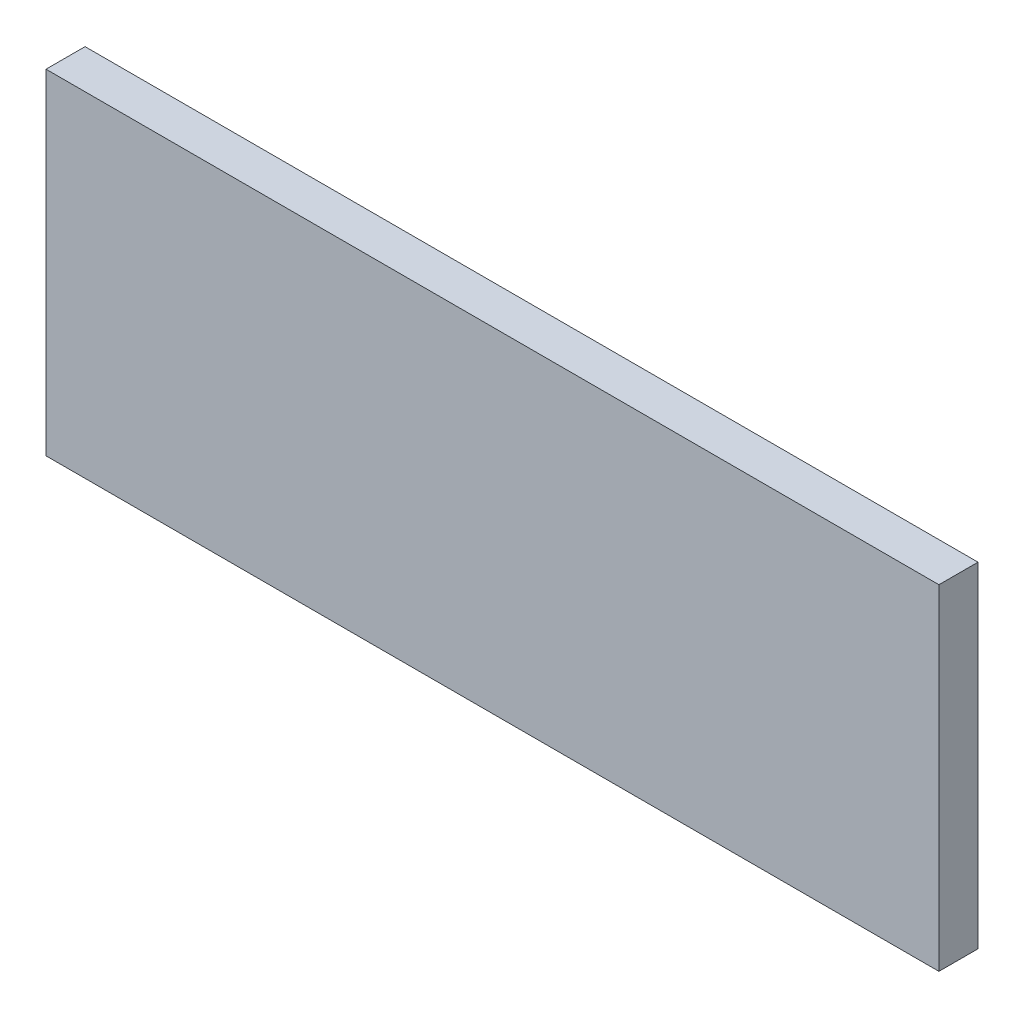
ISO-10303-21;
HEADER;
FILE_DESCRIPTION(('STEP AP214'),'2;1');
FILE_NAME('part.step','',(''),(''),'','','');
FILE_SCHEMA(('AUTOMOTIVE_DESIGN { 1 0 10303 214 1 1 1 1 }'));
ENDSEC;
DATA;
#1=APPLICATION_CONTEXT('core data for automotive mechanical design processes');
#2=APPLICATION_PROTOCOL_DEFINITION('international standard','automotive_design',2000,#1);
#3=PRODUCT_CONTEXT('',#1,'mechanical');
#4=PRODUCT('Part','Part','',(#3));
#5=PRODUCT_RELATED_PRODUCT_CATEGORY('part','',(#4));
#6=PRODUCT_DEFINITION_FORMATION('','',#4);
#7=PRODUCT_DEFINITION_CONTEXT('part definition',#1,'design');
#8=PRODUCT_DEFINITION('design','',#6,#7);
#9=PRODUCT_DEFINITION_SHAPE('','',#8);
#10=(LENGTH_UNIT() NAMED_UNIT(*) SI_UNIT(.MILLI.,.METRE.));
#11=(NAMED_UNIT(*) PLANE_ANGLE_UNIT() SI_UNIT($,.RADIAN.));
#12=(NAMED_UNIT(*) SI_UNIT($,.STERADIAN.) SOLID_ANGLE_UNIT());
#13=UNCERTAINTY_MEASURE_WITH_UNIT(LENGTH_MEASURE(1.E-05),#10,'distance_accuracy_value','');
#14=(GEOMETRIC_REPRESENTATION_CONTEXT(3) GLOBAL_UNCERTAINTY_ASSIGNED_CONTEXT((#13)) GLOBAL_UNIT_ASSIGNED_CONTEXT((#10,
#11,#12)) REPRESENTATION_CONTEXT('',''));
#15=CARTESIAN_POINT('',(0.,0.,0.));
#16=DIRECTION('',(0.,0.,1.));
#17=DIRECTION('',(1.,0.,0.));
#18=AXIS2_PLACEMENT_3D('',#15,#16,#17);
#19=CARTESIAN_POINT('',(133.818,-116.554,1.635));
#20=DIRECTION('',(0.,0.,-1.));
#21=DIRECTION('',(0.,-1.,0.));
#22=AXIS2_PLACEMENT_3D('',#19,#20,#21);
#23=PLANE('',#22);
#24=DIRECTION('',(0.,-1.,0.));
#25=VECTOR('',#24,1.);
#26=CARTESIAN_POINT('',(134.218,-116.404,1.635));
#27=LINE('',#26,#25);
#28=CARTESIAN_POINT('',(134.218,-116.404,1.635));
#29=VERTEX_POINT('',#28);
#30=CARTESIAN_POINT('',(134.218,-116.704,1.635));
#31=VERTEX_POINT('',#30);
#32=EDGE_CURVE('E21',#29,#31,#27,.T.);
#33=ORIENTED_EDGE('',*,*,#32,.F.);
#34=DIRECTION('',(1.,0.,0.));
#35=VECTOR('',#34,1.);
#36=CARTESIAN_POINT('',(133.418,-116.404,1.635));
#37=LINE('',#36,#35);
#38=CARTESIAN_POINT('',(133.418,-116.404,1.635));
#39=VERTEX_POINT('',#38);
#40=EDGE_CURVE('E108',#39,#29,#37,.T.);
#41=ORIENTED_EDGE('',*,*,#40,.F.);
#42=DIRECTION('',(0.,1.,0.));
#43=VECTOR('',#42,1.);
#44=CARTESIAN_POINT('',(133.418,-116.704,1.635));
#45=LINE('',#44,#43);
#46=CARTESIAN_POINT('',(133.418,-116.704,1.635));
#47=VERTEX_POINT('',#46);
#48=EDGE_CURVE('E84',#47,#39,#45,.T.);
#49=ORIENTED_EDGE('',*,*,#48,.F.);
#50=DIRECTION('',(-1.,0.,0.));
#51=VECTOR('',#50,1.);
#52=CARTESIAN_POINT('',(134.218,-116.704,1.635));
#53=LINE('',#52,#51);
#54=EDGE_CURVE('E88',#31,#47,#53,.T.);
#55=ORIENTED_EDGE('',*,*,#54,.F.);
#56=EDGE_LOOP('',(#33,#41,#49,#55));
#57=FACE_BOUND('',#56,.T.);
#58=ADVANCED_FACE('F17',(#57),#23,.F.);
#59=CARTESIAN_POINT('',(133.818,-116.554,1.6));
#60=DIRECTION('',(0.,0.,-1.));
#61=DIRECTION('',(0.,-1.,0.));
#62=AXIS2_PLACEMENT_3D('',#59,#60,#61);
#63=PLANE('',#62);
#64=DIRECTION('',(-1.,0.,0.));
#65=VECTOR('',#64,1.);
#66=CARTESIAN_POINT('',(134.218,-116.704,1.6));
#67=LINE('',#66,#65);
#68=CARTESIAN_POINT('',(134.218,-116.704,1.6));
#69=VERTEX_POINT('',#68);
#70=CARTESIAN_POINT('',(133.418,-116.704,1.6));
#71=VERTEX_POINT('',#70);
#72=EDGE_CURVE('E72',#69,#71,#67,.T.);
#73=ORIENTED_EDGE('',*,*,#72,.T.);
#74=DIRECTION('',(0.,1.,0.));
#75=VECTOR('',#74,1.);
#76=CARTESIAN_POINT('',(133.418,-116.704,1.6));
#77=LINE('',#76,#75);
#78=CARTESIAN_POINT('',(133.418,-116.404,1.6));
#79=VERTEX_POINT('',#78);
#80=EDGE_CURVE('E105',#71,#79,#77,.T.);
#81=ORIENTED_EDGE('',*,*,#80,.T.);
#82=DIRECTION('',(1.,0.,0.));
#83=VECTOR('',#82,1.);
#84=CARTESIAN_POINT('',(133.418,-116.404,1.6));
#85=LINE('',#84,#83);
#86=CARTESIAN_POINT('',(134.218,-116.404,1.6));
#87=VERTEX_POINT('',#86);
#88=EDGE_CURVE('E74',#79,#87,#85,.T.);
#89=ORIENTED_EDGE('',*,*,#88,.T.);
#90=DIRECTION('',(0.,-1.,0.));
#91=VECTOR('',#90,1.);
#92=CARTESIAN_POINT('',(134.218,-116.404,1.6));
#93=LINE('',#92,#91);
#94=EDGE_CURVE('E11',#87,#69,#93,.T.);
#95=ORIENTED_EDGE('',*,*,#94,.T.);
#96=EDGE_LOOP('',(#73,#81,#89,#95));
#97=FACE_BOUND('',#96,.T.);
#98=ADVANCED_FACE('F19',(#97),#63,.T.);
#99=CARTESIAN_POINT('',(134.218,-116.404,1.6));
#100=DIRECTION('',(1.,0.,0.));
#101=DIRECTION('',(0.,1.,0.));
#102=AXIS2_PLACEMENT_3D('',#99,#100,#101);
#103=PLANE('',#102);
#104=DIRECTION('',(0.,0.,1.));
#105=VECTOR('',#104,1.);
#106=CARTESIAN_POINT('',(134.218,-116.404,1.6));
#107=LINE('',#106,#105);
#108=EDGE_CURVE('E112',#87,#29,#107,.T.);
#109=ORIENTED_EDGE('',*,*,#108,.T.);
#110=ORIENTED_EDGE('',*,*,#32,.T.);
#111=DIRECTION('',(0.,0.,1.));
#112=VECTOR('',#111,1.);
#113=CARTESIAN_POINT('',(134.218,-116.704,1.6));
#114=LINE('',#113,#112);
#115=EDGE_CURVE('E80',#69,#31,#114,.T.);
#116=ORIENTED_EDGE('',*,*,#115,.F.);
#117=ORIENTED_EDGE('',*,*,#94,.F.);
#118=EDGE_LOOP('',(#109,#110,#116,#117));
#119=FACE_BOUND('',#118,.T.);
#120=ADVANCED_FACE('F86',(#119),#103,.T.);
#121=CARTESIAN_POINT('',(133.418,-116.404,1.6));
#122=DIRECTION('',(0.,1.,0.));
#123=DIRECTION('',(1.,0.,0.));
#124=AXIS2_PLACEMENT_3D('',#121,#122,#123);
#125=PLANE('',#124);
#126=DIRECTION('',(0.,0.,1.));
#127=VECTOR('',#126,1.);
#128=CARTESIAN_POINT('',(133.418,-116.404,1.6));
#129=LINE('',#128,#127);
#130=EDGE_CURVE('E99',#79,#39,#129,.T.);
#131=ORIENTED_EDGE('',*,*,#130,.T.);
#132=ORIENTED_EDGE('',*,*,#40,.T.);
#133=ORIENTED_EDGE('',*,*,#108,.F.);
#134=ORIENTED_EDGE('',*,*,#88,.F.);
#135=EDGE_LOOP('',(#131,#132,#133,#134));
#136=FACE_BOUND('',#135,.T.);
#137=ADVANCED_FACE('F143',(#136),#125,.T.);
#138=CARTESIAN_POINT('',(133.418,-116.704,1.6));
#139=DIRECTION('',(-1.,0.,0.));
#140=DIRECTION('',(0.,0.,1.));
#141=AXIS2_PLACEMENT_3D('',#138,#139,#140);
#142=PLANE('',#141);
#143=DIRECTION('',(0.,0.,1.));
#144=VECTOR('',#143,1.);
#145=CARTESIAN_POINT('',(133.418,-116.704,1.6));
#146=LINE('',#145,#144);
#147=EDGE_CURVE('E82',#71,#47,#146,.T.);
#148=ORIENTED_EDGE('',*,*,#147,.T.);
#149=ORIENTED_EDGE('',*,*,#48,.T.);
#150=ORIENTED_EDGE('',*,*,#130,.F.);
#151=ORIENTED_EDGE('',*,*,#80,.F.);
#152=EDGE_LOOP('',(#148,#149,#150,#151));
#153=FACE_BOUND('',#152,.T.);
#154=ADVANCED_FACE('F133',(#153),#142,.T.);
#155=CARTESIAN_POINT('',(134.218,-116.704,1.6));
#156=DIRECTION('',(0.,-1.,0.));
#157=DIRECTION('',(0.,0.,-1.));
#158=AXIS2_PLACEMENT_3D('',#155,#156,#157);
#159=PLANE('',#158);
#160=ORIENTED_EDGE('',*,*,#115,.T.);
#161=ORIENTED_EDGE('',*,*,#54,.T.);
#162=ORIENTED_EDGE('',*,*,#147,.F.);
#163=ORIENTED_EDGE('',*,*,#72,.F.);
#164=EDGE_LOOP('',(#160,#161,#162,#163));
#165=FACE_BOUND('',#164,.T.);
#166=ADVANCED_FACE('F78',(#165),#159,.T.);
#167=CLOSED_SHELL('',(#58,#98,#120,#137,#154,#166));
#168=MANIFOLD_SOLID_BREP('B1',#167);
#169=ADVANCED_BREP_SHAPE_REPRESENTATION('',(#18,#168),#14);
#170=SHAPE_DEFINITION_REPRESENTATION(#9,#169);
ENDSEC;
END-ISO-10303-21;
